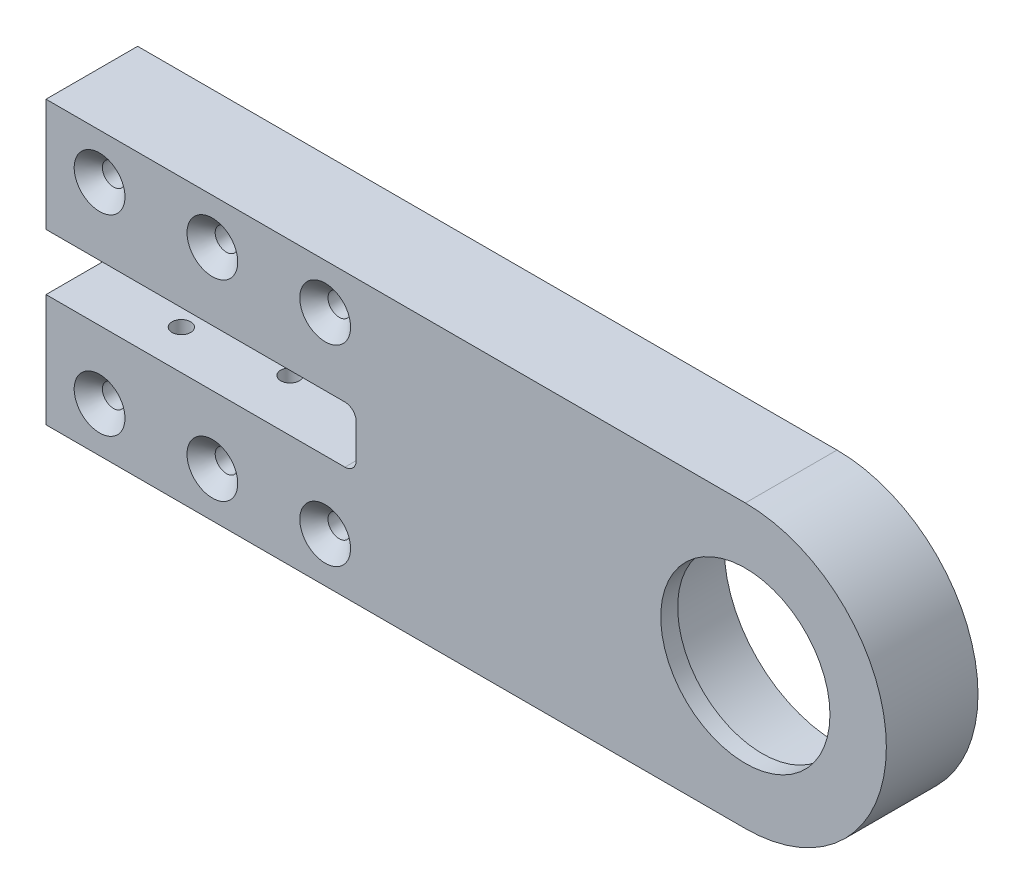
ISO-10303-21;
HEADER;
FILE_DESCRIPTION(('STEP AP214'),'2;1');
FILE_NAME('part.step','',(''),(''),'','','');
FILE_SCHEMA(('AUTOMOTIVE_DESIGN { 1 0 10303 214 1 1 1 1 }'));
ENDSEC;
DATA;
#1=APPLICATION_CONTEXT('core data for automotive mechanical design processes');
#2=APPLICATION_PROTOCOL_DEFINITION('international standard','automotive_design',2000,#1);
#3=PRODUCT_CONTEXT('',#1,'mechanical');
#4=PRODUCT('Part','Part','',(#3));
#5=PRODUCT_RELATED_PRODUCT_CATEGORY('part','',(#4));
#6=PRODUCT_DEFINITION_FORMATION('','',#4);
#7=PRODUCT_DEFINITION_CONTEXT('part definition',#1,'design');
#8=PRODUCT_DEFINITION('design','',#6,#7);
#9=PRODUCT_DEFINITION_SHAPE('','',#8);
#10=(LENGTH_UNIT() NAMED_UNIT(*) SI_UNIT(.MILLI.,.METRE.));
#11=(NAMED_UNIT(*) PLANE_ANGLE_UNIT() SI_UNIT($,.RADIAN.));
#12=(NAMED_UNIT(*) SI_UNIT($,.STERADIAN.) SOLID_ANGLE_UNIT());
#13=UNCERTAINTY_MEASURE_WITH_UNIT(LENGTH_MEASURE(1.E-05),#10,'distance_accuracy_value','');
#14=(GEOMETRIC_REPRESENTATION_CONTEXT(3) GLOBAL_UNCERTAINTY_ASSIGNED_CONTEXT((#13)) GLOBAL_UNIT_ASSIGNED_CONTEXT((#10,
#11,#12)) REPRESENTATION_CONTEXT('',''));
#15=CARTESIAN_POINT('',(0.,0.,0.));
#16=DIRECTION('',(0.,0.,1.));
#17=DIRECTION('',(1.,0.,0.));
#18=AXIS2_PLACEMENT_3D('',#15,#16,#17);
#19=CARTESIAN_POINT('',(-52.5,17.,16.25));
#20=DIRECTION('',(0.,0.,-1.));
#21=DIRECTION('',(-1.,0.,0.));
#22=AXIS2_PLACEMENT_3D('',#19,#20,#21);
#23=CYLINDRICAL_SURFACE('',#22,2.);
#24=CARTESIAN_POINT('',(-52.5,17.,0.));
#25=DIRECTION('',(0.,0.,1.));
#26=DIRECTION('',(1.,0.,0.));
#27=AXIS2_PLACEMENT_3D('',#24,#25,#26);
#28=CIRCLE('',#27,2.);
#29=CARTESIAN_POINT('',(-50.5,17.,0.));
#30=VERTEX_POINT('',#29);
#31=EDGE_CURVE('E218',#30,#30,#28,.T.);
#32=ORIENTED_EDGE('',*,*,#31,.F.);
#33=EDGE_LOOP('',(#32));
#34=FACE_BOUND('',#33,.T.);
#35=CARTESIAN_POINT('',(-52.5,17.,13.75));
#36=DIRECTION('',(0.,0.,1.));
#37=DIRECTION('',(1.,0.,0.));
#38=AXIS2_PLACEMENT_3D('',#35,#36,#37);
#39=CIRCLE('',#38,1.99999999999999);
#40=CARTESIAN_POINT('',(-50.5,17.,13.75));
#41=VERTEX_POINT('',#40);
#42=EDGE_CURVE('E275',#41,#41,#39,.T.);
#43=ORIENTED_EDGE('',*,*,#42,.T.);
#44=EDGE_LOOP('',(#43));
#45=FACE_BOUND('',#44,.T.);
#46=ADVANCED_FACE('F39',(#34,#45),#23,.F.);
#47=CARTESIAN_POINT('',(-32.5,17.,16.25));
#48=DIRECTION('',(0.,0.,-1.));
#49=DIRECTION('',(-1.,0.,0.));
#50=AXIS2_PLACEMENT_3D('',#47,#48,#49);
#51=CYLINDRICAL_SURFACE('',#50,2.);
#52=CARTESIAN_POINT('',(-32.5,17.,0.));
#53=DIRECTION('',(0.,0.,1.));
#54=DIRECTION('',(1.,0.,0.));
#55=AXIS2_PLACEMENT_3D('',#52,#53,#54);
#56=CIRCLE('',#55,2.);
#57=CARTESIAN_POINT('',(-30.5,17.,0.));
#58=VERTEX_POINT('',#57);
#59=EDGE_CURVE('E221',#58,#58,#56,.T.);
#60=ORIENTED_EDGE('',*,*,#59,.F.);
#61=EDGE_LOOP('',(#60));
#62=FACE_BOUND('',#61,.T.);
#63=CARTESIAN_POINT('',(-32.5,17.,13.75));
#64=DIRECTION('',(0.,0.,1.));
#65=DIRECTION('',(1.,0.,0.));
#66=AXIS2_PLACEMENT_3D('',#63,#64,#65);
#67=CIRCLE('',#66,2.);
#68=CARTESIAN_POINT('',(-30.5,17.,13.75));
#69=VERTEX_POINT('',#68);
#70=EDGE_CURVE('E269',#69,#69,#67,.T.);
#71=ORIENTED_EDGE('',*,*,#70,.T.);
#72=EDGE_LOOP('',(#71));
#73=FACE_BOUND('',#72,.T.);
#74=ADVANCED_FACE('F318',(#62,#73),#51,.F.);
#75=CARTESIAN_POINT('',(-12.5,17.,16.25));
#76=DIRECTION('',(0.,0.,-1.));
#77=DIRECTION('',(-1.,0.,0.));
#78=AXIS2_PLACEMENT_3D('',#75,#76,#77);
#79=CYLINDRICAL_SURFACE('',#78,2.);
#80=CARTESIAN_POINT('',(-12.5,17.,0.));
#81=DIRECTION('',(0.,0.,1.));
#82=DIRECTION('',(1.,0.,0.));
#83=AXIS2_PLACEMENT_3D('',#80,#81,#82);
#84=CIRCLE('',#83,2.);
#85=CARTESIAN_POINT('',(-10.5,17.,0.));
#86=VERTEX_POINT('',#85);
#87=EDGE_CURVE('E224',#86,#86,#84,.T.);
#88=ORIENTED_EDGE('',*,*,#87,.F.);
#89=EDGE_LOOP('',(#88));
#90=FACE_BOUND('',#89,.T.);
#91=CARTESIAN_POINT('',(-12.5,17.,13.75));
#92=DIRECTION('',(0.,0.,1.));
#93=DIRECTION('',(1.,0.,0.));
#94=AXIS2_PLACEMENT_3D('',#91,#92,#93);
#95=CIRCLE('',#94,2.);
#96=CARTESIAN_POINT('',(-10.5,17.,13.75));
#97=VERTEX_POINT('',#96);
#98=EDGE_CURVE('E263',#97,#97,#95,.T.);
#99=ORIENTED_EDGE('',*,*,#98,.T.);
#100=EDGE_LOOP('',(#99));
#101=FACE_BOUND('',#100,.T.);
#102=ADVANCED_FACE('F325',(#90,#101),#79,.F.);
#103=CARTESIAN_POINT('',(-52.4999999999996,-17.,16.25));
#104=DIRECTION('',(0.,0.,-1.));
#105=DIRECTION('',(-1.,0.,0.));
#106=AXIS2_PLACEMENT_3D('',#103,#104,#105);
#107=CYLINDRICAL_SURFACE('',#106,2.);
#108=CARTESIAN_POINT('',(-52.4999999999996,-17.,0.));
#109=DIRECTION('',(0.,0.,1.));
#110=DIRECTION('',(1.,0.,0.));
#111=AXIS2_PLACEMENT_3D('',#108,#109,#110);
#112=CIRCLE('',#111,2.);
#113=CARTESIAN_POINT('',(-50.4999999999996,-17.,0.));
#114=VERTEX_POINT('',#113);
#115=EDGE_CURVE('E233',#114,#114,#112,.T.);
#116=ORIENTED_EDGE('',*,*,#115,.F.);
#117=EDGE_LOOP('',(#116));
#118=FACE_BOUND('',#117,.T.);
#119=CARTESIAN_POINT('',(-52.4999999999996,-17.,13.75));
#120=DIRECTION('',(0.,0.,1.));
#121=DIRECTION('',(1.,0.,0.));
#122=AXIS2_PLACEMENT_3D('',#119,#120,#121);
#123=CIRCLE('',#122,1.99999999999999);
#124=CARTESIAN_POINT('',(-50.4999999999996,-17.,13.75));
#125=VERTEX_POINT('',#124);
#126=EDGE_CURVE('E257',#125,#125,#123,.T.);
#127=ORIENTED_EDGE('',*,*,#126,.T.);
#128=EDGE_LOOP('',(#127));
#129=FACE_BOUND('',#128,.T.);
#130=ADVANCED_FACE('F411',(#118,#129),#107,.F.);
#131=CARTESIAN_POINT('',(-12.4999999999996,-17.,16.25));
#132=DIRECTION('',(0.,0.,-1.));
#133=DIRECTION('',(-1.,0.,0.));
#134=AXIS2_PLACEMENT_3D('',#131,#132,#133);
#135=CYLINDRICAL_SURFACE('',#134,2.);
#136=CARTESIAN_POINT('',(-12.4999999999996,-17.,0.));
#137=DIRECTION('',(0.,0.,1.));
#138=DIRECTION('',(1.,0.,0.));
#139=AXIS2_PLACEMENT_3D('',#136,#137,#138);
#140=CIRCLE('',#139,2.);
#141=CARTESIAN_POINT('',(-10.4999999999996,-17.,0.));
#142=VERTEX_POINT('',#141);
#143=EDGE_CURVE('E230',#142,#142,#140,.T.);
#144=ORIENTED_EDGE('',*,*,#143,.F.);
#145=EDGE_LOOP('',(#144));
#146=FACE_BOUND('',#145,.T.);
#147=CARTESIAN_POINT('',(-12.4999999999996,-17.,13.75));
#148=DIRECTION('',(0.,0.,1.));
#149=DIRECTION('',(1.,0.,0.));
#150=AXIS2_PLACEMENT_3D('',#147,#148,#149);
#151=CIRCLE('',#150,2.);
#152=CARTESIAN_POINT('',(-10.4999999999996,-17.,13.75));
#153=VERTEX_POINT('',#152);
#154=EDGE_CURVE('E243',#153,#153,#151,.T.);
#155=ORIENTED_EDGE('',*,*,#154,.T.);
#156=EDGE_LOOP('',(#155));
#157=FACE_BOUND('',#156,.T.);
#158=ADVANCED_FACE('F335',(#146,#157),#135,.F.);
#159=CARTESIAN_POINT('',(62.,0.,16.25));
#160=DIRECTION('',(0.,0.,-1.));
#161=DIRECTION('',(-1.,0.,0.));
#162=AXIS2_PLACEMENT_3D('',#159,#160,#161);
#163=CYLINDRICAL_SURFACE('',#162,20.);
#164=CARTESIAN_POINT('',(62.,0.,0.));
#165=DIRECTION('',(0.,0.,1.));
#166=DIRECTION('',(1.,0.,0.));
#167=AXIS2_PLACEMENT_3D('',#164,#165,#166);
#168=CIRCLE('',#167,20.);
#169=CARTESIAN_POINT('',(82.,0.,0.));
#170=VERTEX_POINT('',#169);
#171=EDGE_CURVE('E153',#170,#170,#168,.T.);
#172=ORIENTED_EDGE('',*,*,#171,.F.);
#173=EDGE_LOOP('',(#172));
#174=FACE_BOUND('',#173,.T.);
#175=CARTESIAN_POINT('',(62.,0.,13.25));
#176=DIRECTION('',(0.,0.,1.));
#177=DIRECTION('',(1.,0.,0.));
#178=AXIS2_PLACEMENT_3D('',#175,#176,#177);
#179=CIRCLE('',#178,20.);
#180=CARTESIAN_POINT('',(82.,0.,13.25));
#181=VERTEX_POINT('',#180);
#182=EDGE_CURVE('E236',#181,#181,#179,.T.);
#183=ORIENTED_EDGE('',*,*,#182,.T.);
#184=EDGE_LOOP('',(#183));
#185=FACE_BOUND('',#184,.T.);
#186=ADVANCED_FACE('F332',(#174,#185),#163,.F.);
#187=CARTESIAN_POINT('',(62.,0.,16.25));
#188=DIRECTION('',(0.,0.,1.));
#189=DIRECTION('',(1.,0.,0.));
#190=AXIS2_PLACEMENT_3D('',#187,#188,#189);
#191=PLANE('',#190);
#192=CARTESIAN_POINT('',(-52.5,17.,16.25));
#193=DIRECTION('',(0.,0.,1.));
#194=DIRECTION('',(1.,0.,0.));
#195=AXIS2_PLACEMENT_3D('',#192,#193,#194);
#196=CIRCLE('',#195,4.5);
#197=CARTESIAN_POINT('',(-48.,17.,16.25));
#198=VERTEX_POINT('',#197);
#199=EDGE_CURVE('E278',#198,#198,#196,.T.);
#200=ORIENTED_EDGE('',*,*,#199,.F.);
#201=EDGE_LOOP('',(#200));
#202=FACE_BOUND('',#201,.T.);
#203=CARTESIAN_POINT('',(-32.5,17.,16.25));
#204=DIRECTION('',(0.,0.,1.));
#205=DIRECTION('',(1.,0.,0.));
#206=AXIS2_PLACEMENT_3D('',#203,#204,#205);
#207=CIRCLE('',#206,4.5);
#208=CARTESIAN_POINT('',(-28.,17.,16.25));
#209=VERTEX_POINT('',#208);
#210=EDGE_CURVE('E272',#209,#209,#207,.T.);
#211=ORIENTED_EDGE('',*,*,#210,.F.);
#212=EDGE_LOOP('',(#211));
#213=FACE_BOUND('',#212,.T.);
#214=CARTESIAN_POINT('',(-12.5,17.,16.25));
#215=DIRECTION('',(0.,0.,1.));
#216=DIRECTION('',(1.,0.,0.));
#217=AXIS2_PLACEMENT_3D('',#214,#215,#216);
#218=CIRCLE('',#217,4.5);
#219=CARTESIAN_POINT('',(-8.,17.,16.25));
#220=VERTEX_POINT('',#219);
#221=EDGE_CURVE('E266',#220,#220,#218,.T.);
#222=ORIENTED_EDGE('',*,*,#221,.F.);
#223=EDGE_LOOP('',(#222));
#224=FACE_BOUND('',#223,.T.);
#225=CARTESIAN_POINT('',(-52.4999999999996,-17.,16.25));
#226=DIRECTION('',(0.,0.,1.));
#227=DIRECTION('',(1.,0.,0.));
#228=AXIS2_PLACEMENT_3D('',#225,#226,#227);
#229=CIRCLE('',#228,4.5);
#230=CARTESIAN_POINT('',(-47.9999999999996,-17.,16.25));
#231=VERTEX_POINT('',#230);
#232=EDGE_CURVE('E260',#231,#231,#229,.T.);
#233=ORIENTED_EDGE('',*,*,#232,.F.);
#234=EDGE_LOOP('',(#233));
#235=FACE_BOUND('',#234,.T.);
#236=CARTESIAN_POINT('',(-32.4999999999996,-17.,16.25));
#237=DIRECTION('',(0.,0.,1.));
#238=DIRECTION('',(1.,0.,0.));
#239=AXIS2_PLACEMENT_3D('',#236,#237,#238);
#240=CIRCLE('',#239,4.5);
#241=CARTESIAN_POINT('',(-27.9999999999996,-17.,16.25));
#242=VERTEX_POINT('',#241);
#243=EDGE_CURVE('E254',#242,#242,#240,.T.);
#244=ORIENTED_EDGE('',*,*,#243,.F.);
#245=EDGE_LOOP('',(#244));
#246=FACE_BOUND('',#245,.T.);
#247=CARTESIAN_POINT('',(-12.4999999999996,-17.,16.25));
#248=DIRECTION('',(0.,0.,1.));
#249=DIRECTION('',(1.,0.,0.));
#250=AXIS2_PLACEMENT_3D('',#247,#248,#249);
#251=CIRCLE('',#250,4.5);
#252=CARTESIAN_POINT('',(-7.99999999999964,-17.,16.25));
#253=VERTEX_POINT('',#252);
#254=EDGE_CURVE('E248',#253,#253,#251,.T.);
#255=ORIENTED_EDGE('',*,*,#254,.F.);
#256=EDGE_LOOP('',(#255));
#257=FACE_BOUND('',#256,.T.);
#258=CARTESIAN_POINT('',(62.,0.,16.25));
#259=DIRECTION('',(0.,0.,1.));
#260=DIRECTION('',(1.,0.,0.));
#261=AXIS2_PLACEMENT_3D('',#258,#259,#260);
#262=CIRCLE('',#261,25.);
#263=CARTESIAN_POINT('',(62.,-25.,16.25));
#264=VERTEX_POINT('',#263);
#265=CARTESIAN_POINT('',(62.,25.,16.25));
#266=VERTEX_POINT('',#265);
#267=EDGE_CURVE('E168',#264,#266,#262,.T.);
#268=ORIENTED_EDGE('',*,*,#267,.T.);
#269=DIRECTION('',(-1.,0.,0.));
#270=VECTOR('',#269,1.);
#271=CARTESIAN_POINT('',(-62.,25.,16.25));
#272=LINE('',#271,#270);
#273=CARTESIAN_POINT('',(-62.,25.,16.25));
#274=VERTEX_POINT('',#273);
#275=EDGE_CURVE('E105',#266,#274,#272,.T.);
#276=ORIENTED_EDGE('',*,*,#275,.T.);
#277=DIRECTION('',(0.,-1.,0.));
#278=VECTOR('',#277,1.);
#279=CARTESIAN_POINT('',(-62.,5.,16.25));
#280=LINE('',#279,#278);
#281=CARTESIAN_POINT('',(-62.,5.,16.25));
#282=VERTEX_POINT('',#281);
#283=EDGE_CURVE('E189',#274,#282,#280,.T.);
#284=ORIENTED_EDGE('',*,*,#283,.T.);
#285=DIRECTION('',(1.,0.,0.));
#286=VECTOR('',#285,1.);
#287=CARTESIAN_POINT('',(-62.,5.,16.25));
#288=LINE('',#287,#286);
#289=CARTESIAN_POINT('',(-8.99999999999999,5.,16.25));
#290=VERTEX_POINT('',#289);
#291=EDGE_CURVE('E208',#282,#290,#288,.T.);
#292=ORIENTED_EDGE('',*,*,#291,.T.);
#293=CARTESIAN_POINT('',(-8.99999999999999,3.00000000000001,16.25));
#294=DIRECTION('',(0.,0.,-1.));
#295=DIRECTION('',(1.,0.,0.));
#296=AXIS2_PLACEMENT_3D('',#293,#294,#295);
#297=CIRCLE('',#296,2.);
#298=CARTESIAN_POINT('',(-6.99999999999999,3.00000000000001,16.25));
#299=VERTEX_POINT('',#298);
#300=EDGE_CURVE('E205',#290,#299,#297,.T.);
#301=ORIENTED_EDGE('',*,*,#300,.T.);
#302=DIRECTION('',(0.,-1.,0.));
#303=VECTOR('',#302,1.);
#304=CARTESIAN_POINT('',(-6.99999999999999,3.00000000000001,16.25));
#305=LINE('',#304,#303);
#306=CARTESIAN_POINT('',(-6.99999999999999,-2.99999999999999,16.25));
#307=VERTEX_POINT('',#306);
#308=EDGE_CURVE('E207',#299,#307,#305,.T.);
#309=ORIENTED_EDGE('',*,*,#308,.T.);
#310=CARTESIAN_POINT('',(-8.99999999999999,-2.99999999999999,16.25));
#311=DIRECTION('',(0.,0.,-1.));
#312=DIRECTION('',(-1.,0.,0.));
#313=AXIS2_PLACEMENT_3D('',#310,#311,#312);
#314=CIRCLE('',#313,2.);
#315=CARTESIAN_POINT('',(-8.99999999999999,-4.99999999999999,16.25));
#316=VERTEX_POINT('',#315);
#317=EDGE_CURVE('E131',#307,#316,#314,.T.);
#318=ORIENTED_EDGE('',*,*,#317,.T.);
#319=DIRECTION('',(-1.,0.,0.));
#320=VECTOR('',#319,1.);
#321=CARTESIAN_POINT('',(-8.99999999999999,-4.99999999999999,16.25));
#322=LINE('',#321,#320);
#323=CARTESIAN_POINT('',(-62.,-5.,16.25));
#324=VERTEX_POINT('',#323);
#325=EDGE_CURVE('E124',#316,#324,#322,.T.);
#326=ORIENTED_EDGE('',*,*,#325,.T.);
#327=DIRECTION('',(0.,-1.,0.));
#328=VECTOR('',#327,1.);
#329=CARTESIAN_POINT('',(-62.,-25.,16.25));
#330=LINE('',#329,#328);
#331=CARTESIAN_POINT('',(-62.,-25.,16.25));
#332=VERTEX_POINT('',#331);
#333=EDGE_CURVE('E129',#324,#332,#330,.T.);
#334=ORIENTED_EDGE('',*,*,#333,.T.);
#335=DIRECTION('',(1.,0.,0.));
#336=VECTOR('',#335,1.);
#337=CARTESIAN_POINT('',(-62.,-25.,16.25));
#338=LINE('',#337,#336);
#339=EDGE_CURVE('E56',#332,#264,#338,.T.);
#340=ORIENTED_EDGE('',*,*,#339,.T.);
#341=EDGE_LOOP('',(#268,#276,#284,#292,#301,#309,#318,#326,#334,#340));
#342=FACE_BOUND('',#341,.T.);
#343=CARTESIAN_POINT('',(62.,0.,16.25));
#344=DIRECTION('',(0.,0.,1.));
#345=DIRECTION('',(1.,0.,0.));
#346=AXIS2_PLACEMENT_3D('',#343,#344,#345);
#347=CIRCLE('',#346,15.);
#348=CARTESIAN_POINT('',(77.,0.,16.25));
#349=VERTEX_POINT('',#348);
#350=EDGE_CURVE('E240',#349,#349,#347,.T.);
#351=ORIENTED_EDGE('',*,*,#350,.F.);
#352=EDGE_LOOP('',(#351));
#353=FACE_BOUND('',#352,.T.);
#354=ADVANCED_FACE('F126',(#202,#213,#224,#235,#246,#257,#342,#353),#191,.T.);
#355=CARTESIAN_POINT('',(62.,0.,0.));
#356=DIRECTION('',(0.,0.,1.));
#357=DIRECTION('',(1.,0.,0.));
#358=AXIS2_PLACEMENT_3D('',#355,#356,#357);
#359=PLANE('',#358);
#360=CARTESIAN_POINT('',(62.,0.,0.));
#361=DIRECTION('',(0.,0.,1.));
#362=DIRECTION('',(1.,0.,0.));
#363=AXIS2_PLACEMENT_3D('',#360,#361,#362);
#364=CIRCLE('',#363,25.);
#365=CARTESIAN_POINT('',(62.,-25.,0.));
#366=VERTEX_POINT('',#365);
#367=CARTESIAN_POINT('',(62.,25.,0.));
#368=VERTEX_POINT('',#367);
#369=EDGE_CURVE('E149',#366,#368,#364,.T.);
#370=ORIENTED_EDGE('',*,*,#369,.F.);
#371=DIRECTION('',(1.,0.,0.));
#372=VECTOR('',#371,1.);
#373=CARTESIAN_POINT('',(-62.,-25.,0.));
#374=LINE('',#373,#372);
#375=CARTESIAN_POINT('',(-62.,-25.,0.));
#376=VERTEX_POINT('',#375);
#377=EDGE_CURVE('E97',#376,#366,#374,.T.);
#378=ORIENTED_EDGE('',*,*,#377,.F.);
#379=DIRECTION('',(0.,-1.,0.));
#380=VECTOR('',#379,1.);
#381=CARTESIAN_POINT('',(-62.,-25.,0.));
#382=LINE('',#381,#380);
#383=CARTESIAN_POINT('',(-62.,-5.,0.));
#384=VERTEX_POINT('',#383);
#385=EDGE_CURVE('E91',#384,#376,#382,.T.);
#386=ORIENTED_EDGE('',*,*,#385,.F.);
#387=DIRECTION('',(-1.,0.,0.));
#388=VECTOR('',#387,1.);
#389=CARTESIAN_POINT('',(-8.99999999999999,-4.99999999999999,0.));
#390=LINE('',#389,#388);
#391=CARTESIAN_POINT('',(-8.99999999999999,-4.99999999999999,0.));
#392=VERTEX_POINT('',#391);
#393=EDGE_CURVE('E139',#392,#384,#390,.T.);
#394=ORIENTED_EDGE('',*,*,#393,.F.);
#395=CARTESIAN_POINT('',(-8.99999999999999,-2.99999999999999,0.));
#396=DIRECTION('',(0.,0.,-1.));
#397=DIRECTION('',(-1.,0.,0.));
#398=AXIS2_PLACEMENT_3D('',#395,#396,#397);
#399=CIRCLE('',#398,2.);
#400=CARTESIAN_POINT('',(-6.99999999999999,-2.99999999999999,0.));
#401=VERTEX_POINT('',#400);
#402=EDGE_CURVE('E163',#401,#392,#399,.T.);
#403=ORIENTED_EDGE('',*,*,#402,.F.);
#404=DIRECTION('',(0.,-1.,0.));
#405=VECTOR('',#404,1.);
#406=CARTESIAN_POINT('',(-6.99999999999999,3.00000000000001,0.));
#407=LINE('',#406,#405);
#408=CARTESIAN_POINT('',(-6.99999999999999,3.00000000000001,0.));
#409=VERTEX_POINT('',#408);
#410=EDGE_CURVE('E161',#409,#401,#407,.T.);
#411=ORIENTED_EDGE('',*,*,#410,.F.);
#412=CARTESIAN_POINT('',(-8.99999999999999,3.00000000000001,0.));
#413=DIRECTION('',(0.,0.,-1.));
#414=DIRECTION('',(1.,0.,0.));
#415=AXIS2_PLACEMENT_3D('',#412,#413,#414);
#416=CIRCLE('',#415,2.);
#417=CARTESIAN_POINT('',(-8.99999999999999,5.,0.));
#418=VERTEX_POINT('',#417);
#419=EDGE_CURVE('E159',#418,#409,#416,.T.);
#420=ORIENTED_EDGE('',*,*,#419,.F.);
#421=DIRECTION('',(1.,0.,0.));
#422=VECTOR('',#421,1.);
#423=CARTESIAN_POINT('',(-62.,5.,0.));
#424=LINE('',#423,#422);
#425=CARTESIAN_POINT('',(-62.,5.,0.));
#426=VERTEX_POINT('',#425);
#427=EDGE_CURVE('E157',#426,#418,#424,.T.);
#428=ORIENTED_EDGE('',*,*,#427,.F.);
#429=DIRECTION('',(0.,-1.,0.));
#430=VECTOR('',#429,1.);
#431=CARTESIAN_POINT('',(-62.,5.,0.));
#432=LINE('',#431,#430);
#433=CARTESIAN_POINT('',(-62.,25.,0.));
#434=VERTEX_POINT('',#433);
#435=EDGE_CURVE('E155',#434,#426,#432,.T.);
#436=ORIENTED_EDGE('',*,*,#435,.F.);
#437=DIRECTION('',(-1.,0.,0.));
#438=VECTOR('',#437,1.);
#439=CARTESIAN_POINT('',(-62.,25.,0.));
#440=LINE('',#439,#438);
#441=EDGE_CURVE('E152',#368,#434,#440,.T.);
#442=ORIENTED_EDGE('',*,*,#441,.F.);
#443=EDGE_LOOP('',(#370,#378,#386,#394,#403,#411,#420,#428,#436,#442));
#444=FACE_BOUND('',#443,.T.);
#445=ORIENTED_EDGE('',*,*,#171,.T.);
#446=EDGE_LOOP('',(#445));
#447=FACE_BOUND('',#446,.T.);
#448=ORIENTED_EDGE('',*,*,#31,.T.);
#449=EDGE_LOOP('',(#448));
#450=FACE_BOUND('',#449,.T.);
#451=ORIENTED_EDGE('',*,*,#59,.T.);
#452=EDGE_LOOP('',(#451));
#453=FACE_BOUND('',#452,.T.);
#454=ORIENTED_EDGE('',*,*,#87,.T.);
#455=EDGE_LOOP('',(#454));
#456=FACE_BOUND('',#455,.T.);
#457=CARTESIAN_POINT('',(-32.4999999999996,-17.,0.));
#458=DIRECTION('',(0.,0.,1.));
#459=DIRECTION('',(1.,0.,0.));
#460=AXIS2_PLACEMENT_3D('',#457,#458,#459);
#461=CIRCLE('',#460,2.);
#462=CARTESIAN_POINT('',(-30.4999999999996,-17.,0.));
#463=VERTEX_POINT('',#462);
#464=EDGE_CURVE('E227',#463,#463,#461,.T.);
#465=ORIENTED_EDGE('',*,*,#464,.T.);
#466=EDGE_LOOP('',(#465));
#467=FACE_BOUND('',#466,.T.);
#468=ORIENTED_EDGE('',*,*,#143,.T.);
#469=EDGE_LOOP('',(#468));
#470=FACE_BOUND('',#469,.T.);
#471=ORIENTED_EDGE('',*,*,#115,.T.);
#472=EDGE_LOOP('',(#471));
#473=FACE_BOUND('',#472,.T.);
#474=ADVANCED_FACE('F193',(#444,#447,#450,#453,#456,#467,#470,#473),#359,.F.);
#475=CARTESIAN_POINT('',(62.,0.,16.25));
#476=DIRECTION('',(0.,0.,-1.));
#477=DIRECTION('',(-1.,0.,0.));
#478=AXIS2_PLACEMENT_3D('',#475,#476,#477);
#479=CYLINDRICAL_SURFACE('',#478,25.);
#480=ORIENTED_EDGE('',*,*,#369,.T.);
#481=DIRECTION('',(0.,0.,-1.));
#482=VECTOR('',#481,1.);
#483=CARTESIAN_POINT('',(62.,25.,16.25));
#484=LINE('',#483,#482);
#485=EDGE_CURVE('E11',#266,#368,#484,.T.);
#486=ORIENTED_EDGE('',*,*,#485,.F.);
#487=ORIENTED_EDGE('',*,*,#267,.F.);
#488=DIRECTION('',(0.,0.,-1.));
#489=VECTOR('',#488,1.);
#490=CARTESIAN_POINT('',(62.,-25.,16.25));
#491=LINE('',#490,#489);
#492=EDGE_CURVE('E145',#264,#366,#491,.T.);
#493=ORIENTED_EDGE('',*,*,#492,.T.);
#494=EDGE_LOOP('',(#480,#486,#487,#493));
#495=FACE_BOUND('',#494,.T.);
#496=ADVANCED_FACE('F41',(#495),#479,.T.);
#497=CARTESIAN_POINT('',(-62.,25.,16.25));
#498=DIRECTION('',(0.,-1.,0.));
#499=DIRECTION('',(0.,0.,-1.));
#500=AXIS2_PLACEMENT_3D('',#497,#498,#499);
#501=PLANE('',#500);
#502=ORIENTED_EDGE('',*,*,#441,.T.);
#503=DIRECTION('',(0.,0.,-1.));
#504=VECTOR('',#503,1.);
#505=CARTESIAN_POINT('',(-62.,25.,16.25));
#506=LINE('',#505,#504);
#507=EDGE_CURVE('E48',#274,#434,#506,.T.);
#508=ORIENTED_EDGE('',*,*,#507,.F.);
#509=ORIENTED_EDGE('',*,*,#275,.F.);
#510=ORIENTED_EDGE('',*,*,#485,.T.);
#511=EDGE_LOOP('',(#502,#508,#509,#510));
#512=FACE_BOUND('',#511,.T.);
#513=ADVANCED_FACE('F360',(#512),#501,.F.);
#514=CARTESIAN_POINT('',(-62.,5.,16.25));
#515=DIRECTION('',(1.,0.,0.));
#516=DIRECTION('',(0.,0.,-1.));
#517=AXIS2_PLACEMENT_3D('',#514,#515,#516);
#518=PLANE('',#517);
#519=ORIENTED_EDGE('',*,*,#435,.T.);
#520=DIRECTION('',(0.,0.,-1.));
#521=VECTOR('',#520,1.);
#522=CARTESIAN_POINT('',(-62.,5.,16.25));
#523=LINE('',#522,#521);
#524=EDGE_CURVE('E181',#282,#426,#523,.T.);
#525=ORIENTED_EDGE('',*,*,#524,.F.);
#526=ORIENTED_EDGE('',*,*,#283,.F.);
#527=ORIENTED_EDGE('',*,*,#507,.T.);
#528=EDGE_LOOP('',(#519,#525,#526,#527));
#529=FACE_BOUND('',#528,.T.);
#530=ADVANCED_FACE('F187',(#529),#518,.F.);
#531=CARTESIAN_POINT('',(-62.,5.,16.25));
#532=DIRECTION('',(0.,1.,0.));
#533=DIRECTION('',(0.,0.,1.));
#534=AXIS2_PLACEMENT_3D('',#531,#532,#533);
#535=PLANE('',#534);
#536=ORIENTED_EDGE('',*,*,#427,.T.);
#537=DIRECTION('',(0.,0.,-1.));
#538=VECTOR('',#537,1.);
#539=CARTESIAN_POINT('',(-8.99999999999999,5.,16.25));
#540=LINE('',#539,#538);
#541=EDGE_CURVE('E178',#290,#418,#540,.T.);
#542=ORIENTED_EDGE('',*,*,#541,.F.);
#543=ORIENTED_EDGE('',*,*,#291,.F.);
#544=ORIENTED_EDGE('',*,*,#524,.T.);
#545=EDGE_LOOP('',(#536,#542,#543,#544));
#546=FACE_BOUND('',#545,.T.);
#547=ADVANCED_FACE('F199',(#546),#535,.F.);
#548=CARTESIAN_POINT('',(-8.99999999999999,3.00000000000001,16.25));
#549=DIRECTION('',(0.,0.,-1.));
#550=DIRECTION('',(-1.,0.,0.));
#551=AXIS2_PLACEMENT_3D('',#548,#549,#550);
#552=CYLINDRICAL_SURFACE('',#551,2.);
#553=ORIENTED_EDGE('',*,*,#419,.T.);
#554=DIRECTION('',(0.,0.,-1.));
#555=VECTOR('',#554,1.);
#556=CARTESIAN_POINT('',(-6.99999999999999,3.00000000000001,16.25));
#557=LINE('',#556,#555);
#558=EDGE_CURVE('E175',#299,#409,#557,.T.);
#559=ORIENTED_EDGE('',*,*,#558,.F.);
#560=ORIENTED_EDGE('',*,*,#300,.F.);
#561=ORIENTED_EDGE('',*,*,#541,.T.);
#562=EDGE_LOOP('',(#553,#559,#560,#561));
#563=FACE_BOUND('',#562,.T.);
#564=ADVANCED_FACE('F203',(#563),#552,.F.);
#565=CARTESIAN_POINT('',(-6.99999999999999,3.00000000000001,16.25));
#566=DIRECTION('',(1.,0.,0.));
#567=DIRECTION('',(0.,1.,0.));
#568=AXIS2_PLACEMENT_3D('',#565,#566,#567);
#569=PLANE('',#568);
#570=ORIENTED_EDGE('',*,*,#410,.T.);
#571=DIRECTION('',(0.,0.,-1.));
#572=VECTOR('',#571,1.);
#573=CARTESIAN_POINT('',(-6.99999999999999,-2.99999999999999,16.25));
#574=LINE('',#573,#572);
#575=EDGE_CURVE('E172',#307,#401,#574,.T.);
#576=ORIENTED_EDGE('',*,*,#575,.F.);
#577=ORIENTED_EDGE('',*,*,#308,.F.);
#578=ORIENTED_EDGE('',*,*,#558,.T.);
#579=EDGE_LOOP('',(#570,#576,#577,#578));
#580=FACE_BOUND('',#579,.T.);
#581=ADVANCED_FACE('F350',(#580),#569,.F.);
#582=CARTESIAN_POINT('',(-8.99999999999999,-2.99999999999999,16.25));
#583=DIRECTION('',(0.,0.,-1.));
#584=DIRECTION('',(-1.,0.,0.));
#585=AXIS2_PLACEMENT_3D('',#582,#583,#584);
#586=CYLINDRICAL_SURFACE('',#585,2.);
#587=ORIENTED_EDGE('',*,*,#402,.T.);
#588=DIRECTION('',(0.,0.,-1.));
#589=VECTOR('',#588,1.);
#590=CARTESIAN_POINT('',(-8.99999999999999,-4.99999999999999,16.25));
#591=LINE('',#590,#589);
#592=EDGE_CURVE('E140',#316,#392,#591,.T.);
#593=ORIENTED_EDGE('',*,*,#592,.F.);
#594=ORIENTED_EDGE('',*,*,#317,.F.);
#595=ORIENTED_EDGE('',*,*,#575,.T.);
#596=EDGE_LOOP('',(#587,#593,#594,#595));
#597=FACE_BOUND('',#596,.T.);
#598=ADVANCED_FACE('F298',(#597),#586,.F.);
#599=CARTESIAN_POINT('',(-8.99999999999999,-4.99999999999999,16.25));
#600=DIRECTION('',(0.,-1.,0.));
#601=DIRECTION('',(1.,0.,0.));
#602=AXIS2_PLACEMENT_3D('',#599,#600,#601);
#603=PLANE('',#602);
#604=CARTESIAN_POINT('',(-45.,-4.99999999999999,9.25));
#605=DIRECTION('',(0.,-1.,0.));
#606=DIRECTION('',(1.,0.,0.));
#607=AXIS2_PLACEMENT_3D('',#604,#605,#606);
#608=CIRCLE('',#607,1.65);
#609=CARTESIAN_POINT('',(-43.35,-4.99999999999999,9.25));
#610=VERTEX_POINT('',#609);
#611=EDGE_CURVE('E285',#610,#610,#608,.F.);
#612=ORIENTED_EDGE('',*,*,#611,.F.);
#613=EDGE_LOOP('',(#612));
#614=FACE_BOUND('',#613,.T.);
#615=CARTESIAN_POINT('',(-27.9435965142987,-4.99999999999999,7.03209555369106));
#616=DIRECTION('',(0.,-1.,0.));
#617=DIRECTION('',(1.,0.,0.));
#618=AXIS2_PLACEMENT_3D('',#615,#616,#617);
#619=CIRCLE('',#618,1.65);
#620=CARTESIAN_POINT('',(-26.2935965142987,-4.99999999999999,7.03209555369106));
#621=VERTEX_POINT('',#620);
#622=EDGE_CURVE('E286',#621,#621,#619,.F.);
#623=ORIENTED_EDGE('',*,*,#622,.F.);
#624=EDGE_LOOP('',(#623));
#625=FACE_BOUND('',#624,.T.);
#626=ORIENTED_EDGE('',*,*,#393,.T.);
#627=DIRECTION('',(0.,0.,-1.));
#628=VECTOR('',#627,1.);
#629=CARTESIAN_POINT('',(-62.,-5.,16.25));
#630=LINE('',#629,#628);
#631=EDGE_CURVE('E136',#324,#384,#630,.T.);
#632=ORIENTED_EDGE('',*,*,#631,.F.);
#633=ORIENTED_EDGE('',*,*,#325,.F.);
#634=ORIENTED_EDGE('',*,*,#592,.T.);
#635=EDGE_LOOP('',(#626,#632,#633,#634));
#636=FACE_BOUND('',#635,.T.);
#637=ADVANCED_FACE('F137',(#614,#625,#636),#603,.F.);
#638=CARTESIAN_POINT('',(-62.,-25.,16.25));
#639=DIRECTION('',(1.,0.,0.));
#640=DIRECTION('',(0.,0.,-1.));
#641=AXIS2_PLACEMENT_3D('',#638,#639,#640);
#642=PLANE('',#641);
#643=ORIENTED_EDGE('',*,*,#385,.T.);
#644=DIRECTION('',(0.,0.,-1.));
#645=VECTOR('',#644,1.);
#646=CARTESIAN_POINT('',(-62.,-25.,16.25));
#647=LINE('',#646,#645);
#648=EDGE_CURVE('E141',#332,#376,#647,.T.);
#649=ORIENTED_EDGE('',*,*,#648,.F.);
#650=ORIENTED_EDGE('',*,*,#333,.F.);
#651=ORIENTED_EDGE('',*,*,#631,.T.);
#652=EDGE_LOOP('',(#643,#649,#650,#651));
#653=FACE_BOUND('',#652,.T.);
#654=ADVANCED_FACE('F143',(#653),#642,.F.);
#655=CARTESIAN_POINT('',(-62.,-25.,16.25));
#656=DIRECTION('',(0.,1.,0.));
#657=DIRECTION('',(0.,0.,1.));
#658=AXIS2_PLACEMENT_3D('',#655,#656,#657);
#659=PLANE('',#658);
#660=CARTESIAN_POINT('',(-45.,-25.,9.25));
#661=DIRECTION('',(0.,-1.,0.));
#662=DIRECTION('',(0.,0.,-1.));
#663=AXIS2_PLACEMENT_3D('',#660,#661,#662);
#664=CIRCLE('',#663,1.65);
#665=CARTESIAN_POINT('',(-45.,-25.,7.6));
#666=VERTEX_POINT('',#665);
#667=EDGE_CURVE('E281',#666,#666,#664,.T.);
#668=ORIENTED_EDGE('',*,*,#667,.F.);
#669=EDGE_LOOP('',(#668));
#670=FACE_BOUND('',#669,.T.);
#671=CARTESIAN_POINT('',(-27.9435965142987,-25.,7.03209555369106));
#672=DIRECTION('',(0.,-1.,0.));
#673=DIRECTION('',(0.,0.,-1.));
#674=AXIS2_PLACEMENT_3D('',#671,#672,#673);
#675=CIRCLE('',#674,1.65);
#676=CARTESIAN_POINT('',(-27.9435965142987,-25.,5.38209555369107));
#677=VERTEX_POINT('',#676);
#678=EDGE_CURVE('E282',#677,#677,#675,.T.);
#679=ORIENTED_EDGE('',*,*,#678,.F.);
#680=EDGE_LOOP('',(#679));
#681=FACE_BOUND('',#680,.T.);
#682=ORIENTED_EDGE('',*,*,#377,.T.);
#683=ORIENTED_EDGE('',*,*,#492,.F.);
#684=ORIENTED_EDGE('',*,*,#339,.F.);
#685=ORIENTED_EDGE('',*,*,#648,.T.);
#686=EDGE_LOOP('',(#682,#683,#684,#685));
#687=FACE_BOUND('',#686,.T.);
#688=ADVANCED_FACE('F342',(#670,#681,#687),#659,.F.);
#689=CARTESIAN_POINT('',(-32.4999999999996,-17.,16.25));
#690=DIRECTION('',(0.,0.,-1.));
#691=DIRECTION('',(-1.,0.,0.));
#692=AXIS2_PLACEMENT_3D('',#689,#690,#691);
#693=CYLINDRICAL_SURFACE('',#692,2.);
#694=CARTESIAN_POINT('',(-32.4999999999996,-17.,13.75));
#695=DIRECTION('',(0.,0.,1.));
#696=DIRECTION('',(1.,0.,0.));
#697=AXIS2_PLACEMENT_3D('',#694,#695,#696);
#698=CIRCLE('',#697,2.);
#699=CARTESIAN_POINT('',(-30.4999999999996,-17.,13.75));
#700=VERTEX_POINT('',#699);
#701=EDGE_CURVE('E251',#700,#700,#698,.T.);
#702=ORIENTED_EDGE('',*,*,#701,.T.);
#703=EDGE_LOOP('',(#702));
#704=FACE_BOUND('',#703,.T.);
#705=ORIENTED_EDGE('',*,*,#464,.F.);
#706=EDGE_LOOP('',(#705));
#707=FACE_BOUND('',#706,.T.);
#708=ADVANCED_FACE('F344',(#704,#707),#693,.F.);
#709=CARTESIAN_POINT('',(62.,0.,13.25));
#710=DIRECTION('',(0.,0.,1.));
#711=DIRECTION('',(1.,0.,0.));
#712=AXIS2_PLACEMENT_3D('',#709,#710,#711);
#713=PLANE('',#712);
#714=CARTESIAN_POINT('',(62.,0.,13.25));
#715=DIRECTION('',(0.,0.,1.));
#716=DIRECTION('',(1.,0.,0.));
#717=AXIS2_PLACEMENT_3D('',#714,#715,#716);
#718=CIRCLE('',#717,15.);
#719=CARTESIAN_POINT('',(77.,0.,13.25));
#720=VERTEX_POINT('',#719);
#721=EDGE_CURVE('E239',#720,#720,#718,.T.);
#722=ORIENTED_EDGE('',*,*,#721,.T.);
#723=EDGE_LOOP('',(#722));
#724=FACE_BOUND('',#723,.T.);
#725=ORIENTED_EDGE('',*,*,#182,.F.);
#726=EDGE_LOOP('',(#725));
#727=FACE_BOUND('',#726,.T.);
#728=ADVANCED_FACE('F392',(#724,#727),#713,.F.);
#729=CARTESIAN_POINT('',(62.,0.,13.25));
#730=DIRECTION('',(0.,0.,1.));
#731=DIRECTION('',(1.,0.,0.));
#732=AXIS2_PLACEMENT_3D('',#729,#730,#731);
#733=CYLINDRICAL_SURFACE('',#732,15.);
#734=ORIENTED_EDGE('',*,*,#721,.F.);
#735=EDGE_LOOP('',(#734));
#736=FACE_BOUND('',#735,.T.);
#737=ORIENTED_EDGE('',*,*,#350,.T.);
#738=EDGE_LOOP('',(#737));
#739=FACE_BOUND('',#738,.T.);
#740=ADVANCED_FACE('F397',(#736,#739),#733,.F.);
#741=CARTESIAN_POINT('',(-12.4999999999996,-17.,16.25));
#742=DIRECTION('',(0.,0.,1.));
#743=DIRECTION('',(1.,0.,0.));
#744=AXIS2_PLACEMENT_3D('',#741,#742,#743);
#745=CONICAL_SURFACE('',#744,4.5,0.785398163397448);
#746=ORIENTED_EDGE('',*,*,#154,.F.);
#747=EDGE_LOOP('',(#746));
#748=FACE_BOUND('',#747,.T.);
#749=ORIENTED_EDGE('',*,*,#254,.T.);
#750=EDGE_LOOP('',(#749));
#751=FACE_BOUND('',#750,.T.);
#752=ADVANCED_FACE('F404',(#748,#751),#745,.F.);
#753=CARTESIAN_POINT('',(-32.4999999999996,-17.,16.25));
#754=DIRECTION('',(0.,0.,1.));
#755=DIRECTION('',(1.,0.,0.));
#756=AXIS2_PLACEMENT_3D('',#753,#754,#755);
#757=CONICAL_SURFACE('',#756,4.5,0.785398163397448);
#758=ORIENTED_EDGE('',*,*,#701,.F.);
#759=EDGE_LOOP('',(#758));
#760=FACE_BOUND('',#759,.T.);
#761=ORIENTED_EDGE('',*,*,#243,.T.);
#762=EDGE_LOOP('',(#761));
#763=FACE_BOUND('',#762,.T.);
#764=ADVANCED_FACE('F438',(#760,#763),#757,.F.);
#765=CARTESIAN_POINT('',(-52.4999999999996,-17.,16.25));
#766=DIRECTION('',(0.,0.,1.));
#767=DIRECTION('',(1.,0.,0.));
#768=AXIS2_PLACEMENT_3D('',#765,#766,#767);
#769=CONICAL_SURFACE('',#768,4.5,0.785398163397448);
#770=ORIENTED_EDGE('',*,*,#126,.F.);
#771=EDGE_LOOP('',(#770));
#772=FACE_BOUND('',#771,.T.);
#773=ORIENTED_EDGE('',*,*,#232,.T.);
#774=EDGE_LOOP('',(#773));
#775=FACE_BOUND('',#774,.T.);
#776=ADVANCED_FACE('F446',(#772,#775),#769,.F.);
#777=CARTESIAN_POINT('',(-12.5,17.,16.25));
#778=DIRECTION('',(0.,0.,1.));
#779=DIRECTION('',(1.,0.,0.));
#780=AXIS2_PLACEMENT_3D('',#777,#778,#779);
#781=CONICAL_SURFACE('',#780,4.5,0.785398163397448);
#782=ORIENTED_EDGE('',*,*,#98,.F.);
#783=EDGE_LOOP('',(#782));
#784=FACE_BOUND('',#783,.T.);
#785=ORIENTED_EDGE('',*,*,#221,.T.);
#786=EDGE_LOOP('',(#785));
#787=FACE_BOUND('',#786,.T.);
#788=ADVANCED_FACE('F454',(#784,#787),#781,.F.);
#789=CARTESIAN_POINT('',(-32.5,17.,16.25));
#790=DIRECTION('',(0.,0.,1.));
#791=DIRECTION('',(1.,0.,0.));
#792=AXIS2_PLACEMENT_3D('',#789,#790,#791);
#793=CONICAL_SURFACE('',#792,4.5,0.785398163397448);
#794=ORIENTED_EDGE('',*,*,#70,.F.);
#795=EDGE_LOOP('',(#794));
#796=FACE_BOUND('',#795,.T.);
#797=ORIENTED_EDGE('',*,*,#210,.T.);
#798=EDGE_LOOP('',(#797));
#799=FACE_BOUND('',#798,.T.);
#800=ADVANCED_FACE('F314',(#796,#799),#793,.F.);
#801=CARTESIAN_POINT('',(-52.5,17.,16.25));
#802=DIRECTION('',(0.,0.,1.));
#803=DIRECTION('',(1.,0.,0.));
#804=AXIS2_PLACEMENT_3D('',#801,#802,#803);
#805=CONICAL_SURFACE('',#804,4.5,0.785398163397449);
#806=ORIENTED_EDGE('',*,*,#42,.F.);
#807=EDGE_LOOP('',(#806));
#808=FACE_BOUND('',#807,.T.);
#809=ORIENTED_EDGE('',*,*,#199,.T.);
#810=EDGE_LOOP('',(#809));
#811=FACE_BOUND('',#810,.T.);
#812=ADVANCED_FACE('F304',(#808,#811),#805,.F.);
#813=CARTESIAN_POINT('',(-27.9435965142987,25.001,7.03209555369106));
#814=DIRECTION('',(0.,-1.,0.));
#815=DIRECTION('',(0.,0.,-1.));
#816=AXIS2_PLACEMENT_3D('',#813,#814,#815);
#817=CYLINDRICAL_SURFACE('',#816,1.65);
#818=ORIENTED_EDGE('',*,*,#678,.T.);
#819=EDGE_LOOP('',(#818));
#820=FACE_BOUND('',#819,.T.);
#821=ORIENTED_EDGE('',*,*,#622,.T.);
#822=EDGE_LOOP('',(#821));
#823=FACE_BOUND('',#822,.T.);
#824=ADVANCED_FACE('F302',(#820,#823),#817,.F.);
#825=CARTESIAN_POINT('',(-45.,25.001,9.25));
#826=DIRECTION('',(0.,-1.,0.));
#827=DIRECTION('',(0.,0.,-1.));
#828=AXIS2_PLACEMENT_3D('',#825,#826,#827);
#829=CYLINDRICAL_SURFACE('',#828,1.65);
#830=ORIENTED_EDGE('',*,*,#667,.T.);
#831=EDGE_LOOP('',(#830));
#832=FACE_BOUND('',#831,.T.);
#833=ORIENTED_EDGE('',*,*,#611,.T.);
#834=EDGE_LOOP('',(#833));
#835=FACE_BOUND('',#834,.T.);
#836=ADVANCED_FACE('F294',(#832,#835),#829,.F.);
#837=CLOSED_SHELL('',(#46,#74,#102,#130,#158,#186,#354,#474,#496,#513,#530,#547,#564,#581,#598,
#637,#654,#688,#708,#728,#740,#752,#764,#776,#788,#800,#812,#824,#836));
#838=MANIFOLD_SOLID_BREP('B2',#837);
#839=ADVANCED_BREP_SHAPE_REPRESENTATION('',(#18,#838),#14);
#840=SHAPE_DEFINITION_REPRESENTATION(#9,#839);
ENDSEC;
END-ISO-10303-21;
